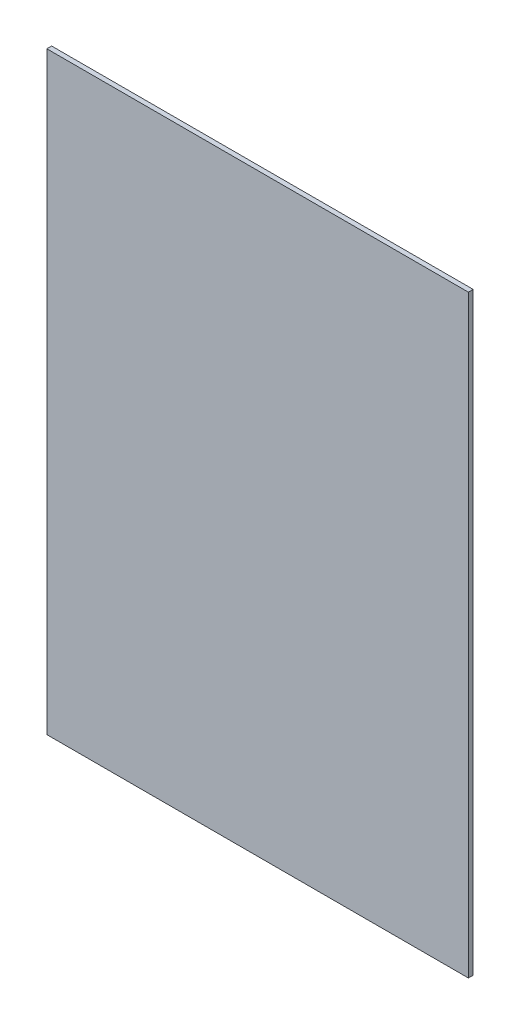
ISO-10303-21;
HEADER;
FILE_DESCRIPTION(('STEP AP214'),'2;1');
FILE_NAME('part.step','',(''),(''),'','','');
FILE_SCHEMA(('AUTOMOTIVE_DESIGN { 1 0 10303 214 1 1 1 1 }'));
ENDSEC;
DATA;
#1=APPLICATION_CONTEXT('core data for automotive mechanical design processes');
#2=APPLICATION_PROTOCOL_DEFINITION('international standard','automotive_design',2000,#1);
#3=PRODUCT_CONTEXT('',#1,'mechanical');
#4=PRODUCT('Part','Part','',(#3));
#5=PRODUCT_RELATED_PRODUCT_CATEGORY('part','',(#4));
#6=PRODUCT_DEFINITION_FORMATION('','',#4);
#7=PRODUCT_DEFINITION_CONTEXT('part definition',#1,'design');
#8=PRODUCT_DEFINITION('design','',#6,#7);
#9=PRODUCT_DEFINITION_SHAPE('','',#8);
#10=(LENGTH_UNIT() NAMED_UNIT(*) SI_UNIT(.MILLI.,.METRE.));
#11=(NAMED_UNIT(*) PLANE_ANGLE_UNIT() SI_UNIT($,.RADIAN.));
#12=(NAMED_UNIT(*) SI_UNIT($,.STERADIAN.) SOLID_ANGLE_UNIT());
#13=UNCERTAINTY_MEASURE_WITH_UNIT(LENGTH_MEASURE(1.E-05),#10,'distance_accuracy_value','');
#14=(GEOMETRIC_REPRESENTATION_CONTEXT(3) GLOBAL_UNCERTAINTY_ASSIGNED_CONTEXT((#13)) GLOBAL_UNIT_ASSIGNED_CONTEXT((#10,
#11,#12)) REPRESENTATION_CONTEXT('',''));
#15=CARTESIAN_POINT('',(0.,0.,0.));
#16=DIRECTION('',(0.,0.,1.));
#17=DIRECTION('',(1.,0.,0.));
#18=AXIS2_PLACEMENT_3D('',#15,#16,#17);
#19=CARTESIAN_POINT('',(220.,-310.,5.));
#20=DIRECTION('',(-1.,0.,0.));
#21=DIRECTION('',(0.,0.,1.));
#22=AXIS2_PLACEMENT_3D('',#19,#20,#21);
#23=PLANE('',#22);
#24=DIRECTION('',(0.,1.,0.));
#25=VECTOR('',#24,1.);
#26=CARTESIAN_POINT('',(220.,-310.,0.));
#27=LINE('',#26,#25);
#28=CARTESIAN_POINT('',(220.,-310.,0.));
#29=VERTEX_POINT('',#28);
#30=CARTESIAN_POINT('',(220.,310.,0.));
#31=VERTEX_POINT('',#30);
#32=EDGE_CURVE('E96',#29,#31,#27,.T.);
#33=ORIENTED_EDGE('',*,*,#32,.T.);
#34=DIRECTION('',(0.,0.,-1.));
#35=VECTOR('',#34,1.);
#36=CARTESIAN_POINT('',(220.,310.,5.));
#37=LINE('',#36,#35);
#38=CARTESIAN_POINT('',(220.,310.,5.));
#39=VERTEX_POINT('',#38);
#40=EDGE_CURVE('E11',#39,#31,#37,.T.);
#41=ORIENTED_EDGE('',*,*,#40,.F.);
#42=DIRECTION('',(0.,1.,0.));
#43=VECTOR('',#42,1.);
#44=CARTESIAN_POINT('',(220.,-310.,5.));
#45=LINE('',#44,#43);
#46=CARTESIAN_POINT('',(220.,-310.,5.));
#47=VERTEX_POINT('',#46);
#48=EDGE_CURVE('E84',#47,#39,#45,.T.);
#49=ORIENTED_EDGE('',*,*,#48,.F.);
#50=DIRECTION('',(0.,0.,-1.));
#51=VECTOR('',#50,1.);
#52=CARTESIAN_POINT('',(220.,-310.,5.));
#53=LINE('',#52,#51);
#54=EDGE_CURVE('E92',#47,#29,#53,.T.);
#55=ORIENTED_EDGE('',*,*,#54,.T.);
#56=EDGE_LOOP('',(#33,#41,#49,#55));
#57=FACE_BOUND('',#56,.T.);
#58=ADVANCED_FACE('F33',(#57),#23,.F.);
#59=CARTESIAN_POINT('',(-220.,310.,5.));
#60=DIRECTION('',(0.,-1.,0.));
#61=DIRECTION('',(0.,0.,-1.));
#62=AXIS2_PLACEMENT_3D('',#59,#60,#61);
#63=PLANE('',#62);
#64=DIRECTION('',(-1.,0.,0.));
#65=VECTOR('',#64,1.);
#66=CARTESIAN_POINT('',(-220.,310.,0.));
#67=LINE('',#66,#65);
#68=CARTESIAN_POINT('',(-220.,310.,0.));
#69=VERTEX_POINT('',#68);
#70=EDGE_CURVE('E88',#31,#69,#67,.T.);
#71=ORIENTED_EDGE('',*,*,#70,.T.);
#72=DIRECTION('',(0.,0.,-1.));
#73=VECTOR('',#72,1.);
#74=CARTESIAN_POINT('',(-220.,310.,5.));
#75=LINE('',#74,#73);
#76=CARTESIAN_POINT('',(-220.,310.,5.));
#77=VERTEX_POINT('',#76);
#78=EDGE_CURVE('E41',#77,#69,#75,.T.);
#79=ORIENTED_EDGE('',*,*,#78,.F.);
#80=DIRECTION('',(-1.,0.,0.));
#81=VECTOR('',#80,1.);
#82=CARTESIAN_POINT('',(-220.,310.,5.));
#83=LINE('',#82,#81);
#84=EDGE_CURVE('E79',#39,#77,#83,.T.);
#85=ORIENTED_EDGE('',*,*,#84,.F.);
#86=ORIENTED_EDGE('',*,*,#40,.T.);
#87=EDGE_LOOP('',(#71,#79,#85,#86));
#88=FACE_BOUND('',#87,.T.);
#89=ADVANCED_FACE('F87',(#88),#63,.F.);
#90=CARTESIAN_POINT('',(-220.,-310.,5.));
#91=DIRECTION('',(1.,0.,0.));
#92=DIRECTION('',(0.,0.,-1.));
#93=AXIS2_PLACEMENT_3D('',#90,#91,#92);
#94=PLANE('',#93);
#95=DIRECTION('',(0.,-1.,0.));
#96=VECTOR('',#95,1.);
#97=CARTESIAN_POINT('',(-220.,-310.,0.));
#98=LINE('',#97,#96);
#99=CARTESIAN_POINT('',(-220.,-310.,0.));
#100=VERTEX_POINT('',#99);
#101=EDGE_CURVE('E66',#69,#100,#98,.T.);
#102=ORIENTED_EDGE('',*,*,#101,.T.);
#103=DIRECTION('',(0.,0.,-1.));
#104=VECTOR('',#103,1.);
#105=CARTESIAN_POINT('',(-220.,-310.,5.));
#106=LINE('',#105,#104);
#107=CARTESIAN_POINT('',(-220.,-310.,5.));
#108=VERTEX_POINT('',#107);
#109=EDGE_CURVE('E89',#108,#100,#106,.T.);
#110=ORIENTED_EDGE('',*,*,#109,.F.);
#111=DIRECTION('',(0.,-1.,0.));
#112=VECTOR('',#111,1.);
#113=CARTESIAN_POINT('',(-220.,-310.,5.));
#114=LINE('',#113,#112);
#115=EDGE_CURVE('E82',#77,#108,#114,.T.);
#116=ORIENTED_EDGE('',*,*,#115,.F.);
#117=ORIENTED_EDGE('',*,*,#78,.T.);
#118=EDGE_LOOP('',(#102,#110,#116,#117));
#119=FACE_BOUND('',#118,.T.);
#120=ADVANCED_FACE('F90',(#119),#94,.F.);
#121=CARTESIAN_POINT('',(-220.,-310.,5.));
#122=DIRECTION('',(0.,1.,0.));
#123=DIRECTION('',(0.,0.,1.));
#124=AXIS2_PLACEMENT_3D('',#121,#122,#123);
#125=PLANE('',#124);
#126=DIRECTION('',(1.,0.,0.));
#127=VECTOR('',#126,1.);
#128=CARTESIAN_POINT('',(-220.,-310.,0.));
#129=LINE('',#128,#127);
#130=EDGE_CURVE('E72',#100,#29,#129,.T.);
#131=ORIENTED_EDGE('',*,*,#130,.T.);
#132=ORIENTED_EDGE('',*,*,#54,.F.);
#133=DIRECTION('',(1.,0.,0.));
#134=VECTOR('',#133,1.);
#135=CARTESIAN_POINT('',(-220.,-310.,5.));
#136=LINE('',#135,#134);
#137=EDGE_CURVE('E49',#108,#47,#136,.T.);
#138=ORIENTED_EDGE('',*,*,#137,.F.);
#139=ORIENTED_EDGE('',*,*,#109,.T.);
#140=EDGE_LOOP('',(#131,#132,#138,#139));
#141=FACE_BOUND('',#140,.T.);
#142=ADVANCED_FACE('F103',(#141),#125,.F.);
#143=CARTESIAN_POINT('',(0.,0.,5.));
#144=DIRECTION('',(0.,0.,-1.));
#145=DIRECTION('',(-1.,0.,0.));
#146=AXIS2_PLACEMENT_3D('',#143,#144,#145);
#147=PLANE('',#146);
#148=ORIENTED_EDGE('',*,*,#48,.T.);
#149=ORIENTED_EDGE('',*,*,#84,.T.);
#150=ORIENTED_EDGE('',*,*,#115,.T.);
#151=ORIENTED_EDGE('',*,*,#137,.T.);
#152=EDGE_LOOP('',(#148,#149,#150,#151));
#153=FACE_BOUND('',#152,.T.);
#154=ADVANCED_FACE('F80',(#153),#147,.F.);
#155=CARTESIAN_POINT('',(0.,0.,0.));
#156=DIRECTION('',(0.,0.,-1.));
#157=DIRECTION('',(-1.,0.,0.));
#158=AXIS2_PLACEMENT_3D('',#155,#156,#157);
#159=PLANE('',#158);
#160=ORIENTED_EDGE('',*,*,#32,.F.);
#161=ORIENTED_EDGE('',*,*,#130,.F.);
#162=ORIENTED_EDGE('',*,*,#101,.F.);
#163=ORIENTED_EDGE('',*,*,#70,.F.);
#164=EDGE_LOOP('',(#160,#161,#162,#163));
#165=FACE_BOUND('',#164,.T.);
#166=ADVANCED_FACE('F106',(#165),#159,.T.);
#167=CLOSED_SHELL('',(#58,#89,#120,#142,#154,#166));
#168=MANIFOLD_SOLID_BREP('B2',#167);
#169=ADVANCED_BREP_SHAPE_REPRESENTATION('',(#18,#168),#14);
#170=SHAPE_DEFINITION_REPRESENTATION(#9,#169);
ENDSEC;
END-ISO-10303-21;
